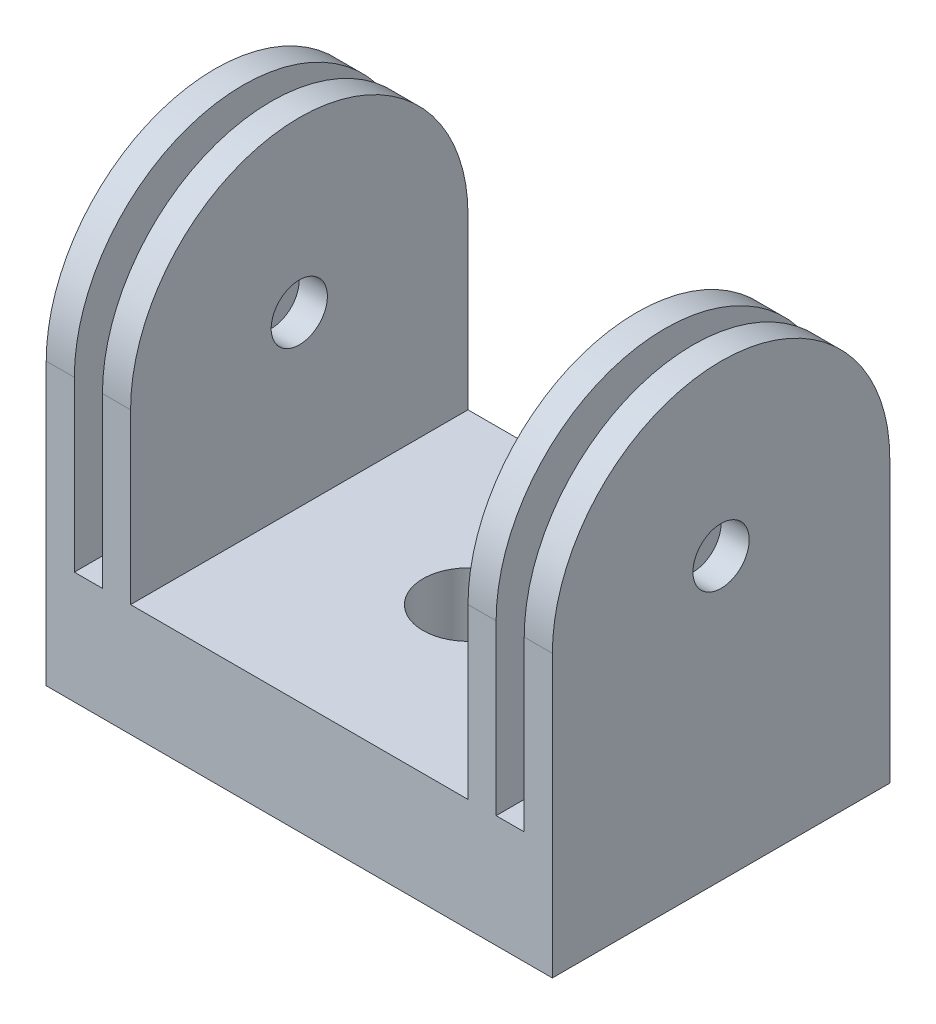
ISO-10303-21;
HEADER;
FILE_DESCRIPTION(('STEP AP214'),'2;1');
FILE_NAME('part.step','',(''),(''),'','','');
FILE_SCHEMA(('AUTOMOTIVE_DESIGN { 1 0 10303 214 1 1 1 1 }'));
ENDSEC;
DATA;
#1=APPLICATION_CONTEXT('core data for automotive mechanical design processes');
#2=APPLICATION_PROTOCOL_DEFINITION('international standard','automotive_design',2000,#1);
#3=PRODUCT_CONTEXT('',#1,'mechanical');
#4=PRODUCT('Part','Part','',(#3));
#5=PRODUCT_RELATED_PRODUCT_CATEGORY('part','',(#4));
#6=PRODUCT_DEFINITION_FORMATION('','',#4);
#7=PRODUCT_DEFINITION_CONTEXT('part definition',#1,'design');
#8=PRODUCT_DEFINITION('design','',#6,#7);
#9=PRODUCT_DEFINITION_SHAPE('','',#8);
#10=(LENGTH_UNIT() NAMED_UNIT(*) SI_UNIT(.MILLI.,.METRE.));
#11=(NAMED_UNIT(*) PLANE_ANGLE_UNIT() SI_UNIT($,.RADIAN.));
#12=(NAMED_UNIT(*) SI_UNIT($,.STERADIAN.) SOLID_ANGLE_UNIT());
#13=UNCERTAINTY_MEASURE_WITH_UNIT(LENGTH_MEASURE(1.E-05),#10,'distance_accuracy_value','');
#14=(GEOMETRIC_REPRESENTATION_CONTEXT(3) GLOBAL_UNCERTAINTY_ASSIGNED_CONTEXT((#13)) GLOBAL_UNIT_ASSIGNED_CONTEXT((#10,
#11,#12)) REPRESENTATION_CONTEXT('',''));
#15=CARTESIAN_POINT('',(0.,0.,0.));
#16=DIRECTION('',(0.,0.,1.));
#17=DIRECTION('',(1.,0.,0.));
#18=AXIS2_PLACEMENT_3D('',#15,#16,#17);
#19=CARTESIAN_POINT('',(0.,10.,0.));
#20=DIRECTION('',(0.,1.,0.));
#21=DIRECTION('',(0.,0.,1.));
#22=AXIS2_PLACEMENT_3D('',#19,#20,#21);
#23=PLANE('',#22);
#24=CARTESIAN_POINT('',(0.,10.,0.));
#25=DIRECTION('',(0.,1.,0.));
#26=DIRECTION('',(0.,0.,1.));
#27=AXIS2_PLACEMENT_3D('',#24,#25,#26);
#28=CIRCLE('',#27,4.);
#29=CARTESIAN_POINT('',(0.,10.,4.));
#30=VERTEX_POINT('',#29);
#31=EDGE_CURVE('E330',#30,#30,#28,.T.);
#32=ORIENTED_EDGE('',*,*,#31,.F.);
#33=EDGE_LOOP('',(#32));
#34=FACE_BOUND('',#33,.T.);
#35=DIRECTION('',(1.,0.,0.));
#36=VECTOR('',#35,1.);
#37=CARTESIAN_POINT('',(0.,10.,-15.));
#38=LINE('',#37,#36);
#39=CARTESIAN_POINT('',(-15.,10.,-15.));
#40=VERTEX_POINT('',#39);
#41=CARTESIAN_POINT('',(15.,10.,-15.));
#42=VERTEX_POINT('',#41);
#43=EDGE_CURVE('E71',#40,#42,#38,.T.);
#44=ORIENTED_EDGE('',*,*,#43,.F.);
#45=DIRECTION('',(0.,0.,-1.));
#46=VECTOR('',#45,1.);
#47=CARTESIAN_POINT('',(-15.,10.,15.));
#48=LINE('',#47,#46);
#49=CARTESIAN_POINT('',(-15.,10.,15.));
#50=VERTEX_POINT('',#49);
#51=EDGE_CURVE('E234',#50,#40,#48,.T.);
#52=ORIENTED_EDGE('',*,*,#51,.F.);
#53=DIRECTION('',(1.,0.,0.));
#54=VECTOR('',#53,1.);
#55=CARTESIAN_POINT('',(0.,10.,15.));
#56=LINE('',#55,#54);
#57=CARTESIAN_POINT('',(15.,10.,15.));
#58=VERTEX_POINT('',#57);
#59=EDGE_CURVE('E342',#50,#58,#56,.T.);
#60=ORIENTED_EDGE('',*,*,#59,.T.);
#61=DIRECTION('',(0.,0.,-1.));
#62=VECTOR('',#61,1.);
#63=CARTESIAN_POINT('',(15.,10.,15.));
#64=LINE('',#63,#62);
#65=EDGE_CURVE('E264',#58,#42,#64,.T.);
#66=ORIENTED_EDGE('',*,*,#65,.T.);
#67=EDGE_LOOP('',(#44,#52,#60,#66));
#68=FACE_BOUND('',#67,.T.);
#69=ADVANCED_FACE('F47',(#34,#68),#23,.T.);
#70=DIRECTION('',(0.,0.,-1.));
#71=VECTOR('',#70,1.);
#72=CARTESIAN_POINT('',(-20.,10.,15.));
#73=LINE('',#72,#71);
#74=CARTESIAN_POINT('',(-20.,10.,15.));
#75=VERTEX_POINT('',#74);
#76=CARTESIAN_POINT('',(-20.,10.,-15.));
#77=VERTEX_POINT('',#76);
#78=EDGE_CURVE('E185',#75,#77,#73,.T.);
#79=ORIENTED_EDGE('',*,*,#78,.F.);
#80=CARTESIAN_POINT('',(-17.5,10.,15.));
#81=VERTEX_POINT('',#80);
#82=EDGE_CURVE('E190',#75,#81,#56,.T.);
#83=ORIENTED_EDGE('',*,*,#82,.T.);
#84=DIRECTION('',(0.,0.,-1.));
#85=VECTOR('',#84,1.);
#86=CARTESIAN_POINT('',(-17.5,10.,15.));
#87=LINE('',#86,#85);
#88=CARTESIAN_POINT('',(-17.5,10.,-15.));
#89=VERTEX_POINT('',#88);
#90=EDGE_CURVE('E218',#81,#89,#87,.T.);
#91=ORIENTED_EDGE('',*,*,#90,.T.);
#92=EDGE_CURVE('E63',#77,#89,#38,.T.);
#93=ORIENTED_EDGE('',*,*,#92,.F.);
#94=EDGE_LOOP('',(#79,#83,#91,#93));
#95=FACE_BOUND('',#94,.T.);
#96=ADVANCED_FACE('F423',(#95),#23,.T.);
#97=DIRECTION('',(0.,0.,-1.));
#98=VECTOR('',#97,1.);
#99=CARTESIAN_POINT('',(17.5,10.,15.));
#100=LINE('',#99,#98);
#101=CARTESIAN_POINT('',(17.5,10.,15.));
#102=VERTEX_POINT('',#101);
#103=CARTESIAN_POINT('',(17.5,10.,-15.));
#104=VERTEX_POINT('',#103);
#105=EDGE_CURVE('E270',#102,#104,#100,.T.);
#106=ORIENTED_EDGE('',*,*,#105,.F.);
#107=CARTESIAN_POINT('',(20.,10.,15.));
#108=VERTEX_POINT('',#107);
#109=EDGE_CURVE('E338',#102,#108,#56,.T.);
#110=ORIENTED_EDGE('',*,*,#109,.T.);
#111=DIRECTION('',(0.,0.,-1.));
#112=VECTOR('',#111,1.);
#113=CARTESIAN_POINT('',(20.,10.,15.));
#114=LINE('',#113,#112);
#115=CARTESIAN_POINT('',(20.,10.,-15.));
#116=VERTEX_POINT('',#115);
#117=EDGE_CURVE('E306',#108,#116,#114,.T.);
#118=ORIENTED_EDGE('',*,*,#117,.T.);
#119=EDGE_CURVE('E334',#104,#116,#38,.T.);
#120=ORIENTED_EDGE('',*,*,#119,.F.);
#121=EDGE_LOOP('',(#106,#110,#118,#120));
#122=FACE_BOUND('',#121,.T.);
#123=ADVANCED_FACE('F391',(#122),#23,.T.);
#124=CARTESIAN_POINT('',(22.5,10.,0.));
#125=DIRECTION('',(1.,0.,0.));
#126=DIRECTION('',(0.,0.,-1.));
#127=AXIS2_PLACEMENT_3D('',#124,#125,#126);
#128=PLANE('',#127);
#129=DIRECTION('',(0.,0.,1.));
#130=VECTOR('',#129,1.);
#131=CARTESIAN_POINT('',(22.5,0.,0.));
#132=LINE('',#131,#130);
#133=CARTESIAN_POINT('',(22.5,0.,-15.));
#134=VERTEX_POINT('',#133);
#135=CARTESIAN_POINT('',(22.5,0.,15.));
#136=VERTEX_POINT('',#135);
#137=EDGE_CURVE('E346',#134,#136,#132,.T.);
#138=ORIENTED_EDGE('',*,*,#137,.F.);
#139=DIRECTION('',(0.,-1.,0.));
#140=VECTOR('',#139,1.);
#141=CARTESIAN_POINT('',(22.5,10.,-15.));
#142=LINE('',#141,#140);
#143=CARTESIAN_POINT('',(22.5,25.,-15.));
#144=VERTEX_POINT('',#143);
#145=EDGE_CURVE('E11',#144,#134,#142,.T.);
#146=ORIENTED_EDGE('',*,*,#145,.F.);
#147=CARTESIAN_POINT('',(22.5,25.,0.));
#148=DIRECTION('',(1.,0.,0.));
#149=DIRECTION('',(0.,0.,1.));
#150=AXIS2_PLACEMENT_3D('',#147,#148,#149);
#151=CIRCLE('',#150,15.);
#152=CARTESIAN_POINT('',(22.5,25.,15.));
#153=VERTEX_POINT('',#152);
#154=EDGE_CURVE('E298',#144,#153,#151,.T.);
#155=ORIENTED_EDGE('',*,*,#154,.T.);
#156=DIRECTION('',(0.,-1.,0.));
#157=VECTOR('',#156,1.);
#158=CARTESIAN_POINT('',(22.5,10.,15.));
#159=LINE('',#158,#157);
#160=EDGE_CURVE('E341',#153,#136,#159,.T.);
#161=ORIENTED_EDGE('',*,*,#160,.T.);
#162=EDGE_LOOP('',(#138,#146,#155,#161));
#163=FACE_BOUND('',#162,.T.);
#164=CARTESIAN_POINT('',(22.5,25.,0.));
#165=DIRECTION('',(1.,0.,0.));
#166=DIRECTION('',(0.,0.,-1.));
#167=AXIS2_PLACEMENT_3D('',#164,#165,#166);
#168=CIRCLE('',#167,2.5);
#169=CARTESIAN_POINT('',(22.5,25.,-2.5));
#170=VERTEX_POINT('',#169);
#171=EDGE_CURVE('E290',#170,#170,#168,.T.);
#172=ORIENTED_EDGE('',*,*,#171,.F.);
#173=EDGE_LOOP('',(#172));
#174=FACE_BOUND('',#173,.T.);
#175=ADVANCED_FACE('F377',(#163,#174),#128,.T.);
#176=CARTESIAN_POINT('',(0.,10.,-15.));
#177=DIRECTION('',(0.,0.,-1.));
#178=DIRECTION('',(-1.,0.,0.));
#179=AXIS2_PLACEMENT_3D('',#176,#177,#178);
#180=PLANE('',#179);
#181=DIRECTION('',(1.,0.,0.));
#182=VECTOR('',#181,1.);
#183=CARTESIAN_POINT('',(0.,0.,-15.));
#184=LINE('',#183,#182);
#185=CARTESIAN_POINT('',(-22.5,0.,-15.));
#186=VERTEX_POINT('',#185);
#187=EDGE_CURVE('E350',#186,#134,#184,.T.);
#188=ORIENTED_EDGE('',*,*,#187,.F.);
#189=DIRECTION('',(0.,-1.,0.));
#190=VECTOR('',#189,1.);
#191=CARTESIAN_POINT('',(-22.5,10.,-15.));
#192=LINE('',#191,#190);
#193=CARTESIAN_POINT('',(-22.5,25.,-15.));
#194=VERTEX_POINT('',#193);
#195=EDGE_CURVE('E56',#194,#186,#192,.T.);
#196=ORIENTED_EDGE('',*,*,#195,.F.);
#197=DIRECTION('',(-1.,0.,0.));
#198=VECTOR('',#197,1.);
#199=CARTESIAN_POINT('',(-20.,25.,-15.));
#200=LINE('',#199,#198);
#201=CARTESIAN_POINT('',(-20.,25.,-15.));
#202=VERTEX_POINT('',#201);
#203=EDGE_CURVE('E184',#202,#194,#200,.T.);
#204=ORIENTED_EDGE('',*,*,#203,.F.);
#205=DIRECTION('',(0.,1.,0.));
#206=VECTOR('',#205,1.);
#207=CARTESIAN_POINT('',(-20.,10.,-15.));
#208=LINE('',#207,#206);
#209=EDGE_CURVE('E169',#77,#202,#208,.T.);
#210=ORIENTED_EDGE('',*,*,#209,.F.);
#211=ORIENTED_EDGE('',*,*,#92,.T.);
#212=DIRECTION('',(0.,1.,0.));
#213=VECTOR('',#212,1.);
#214=CARTESIAN_POINT('',(-17.5,10.,-15.));
#215=LINE('',#214,#213);
#216=CARTESIAN_POINT('',(-17.5,25.,-15.));
#217=VERTEX_POINT('',#216);
#218=EDGE_CURVE('E222',#89,#217,#215,.T.);
#219=ORIENTED_EDGE('',*,*,#218,.T.);
#220=DIRECTION('',(1.,0.,0.));
#221=VECTOR('',#220,1.);
#222=CARTESIAN_POINT('',(-17.5,25.,-15.));
#223=LINE('',#222,#221);
#224=CARTESIAN_POINT('',(-15.,25.,-15.));
#225=VERTEX_POINT('',#224);
#226=EDGE_CURVE('E230',#217,#225,#223,.T.);
#227=ORIENTED_EDGE('',*,*,#226,.T.);
#228=DIRECTION('',(0.,1.,0.));
#229=VECTOR('',#228,1.);
#230=CARTESIAN_POINT('',(-15.,10.,-15.));
#231=LINE('',#230,#229);
#232=EDGE_CURVE('E238',#40,#225,#231,.T.);
#233=ORIENTED_EDGE('',*,*,#232,.F.);
#234=ORIENTED_EDGE('',*,*,#43,.T.);
#235=DIRECTION('',(0.,1.,0.));
#236=VECTOR('',#235,1.);
#237=CARTESIAN_POINT('',(15.,10.,-15.));
#238=LINE('',#237,#236);
#239=CARTESIAN_POINT('',(15.,25.,-15.));
#240=VERTEX_POINT('',#239);
#241=EDGE_CURVE('E281',#42,#240,#238,.T.);
#242=ORIENTED_EDGE('',*,*,#241,.T.);
#243=DIRECTION('',(-1.,0.,0.));
#244=VECTOR('',#243,1.);
#245=CARTESIAN_POINT('',(17.5,25.,-15.));
#246=LINE('',#245,#244);
#247=CARTESIAN_POINT('',(17.5,25.,-15.));
#248=VERTEX_POINT('',#247);
#249=EDGE_CURVE('E286',#248,#240,#246,.T.);
#250=ORIENTED_EDGE('',*,*,#249,.F.);
#251=DIRECTION('',(0.,1.,0.));
#252=VECTOR('',#251,1.);
#253=CARTESIAN_POINT('',(17.5,10.,-15.));
#254=LINE('',#253,#252);
#255=EDGE_CURVE('E267',#104,#248,#254,.T.);
#256=ORIENTED_EDGE('',*,*,#255,.F.);
#257=ORIENTED_EDGE('',*,*,#119,.T.);
#258=DIRECTION('',(0.,1.,0.));
#259=VECTOR('',#258,1.);
#260=CARTESIAN_POINT('',(20.,10.,-15.));
#261=LINE('',#260,#259);
#262=CARTESIAN_POINT('',(20.,25.,-15.));
#263=VERTEX_POINT('',#262);
#264=EDGE_CURVE('E310',#116,#263,#261,.T.);
#265=ORIENTED_EDGE('',*,*,#264,.T.);
#266=DIRECTION('',(1.,0.,0.));
#267=VECTOR('',#266,1.);
#268=CARTESIAN_POINT('',(20.,25.,-15.));
#269=LINE('',#268,#267);
#270=EDGE_CURVE('E318',#263,#144,#269,.T.);
#271=ORIENTED_EDGE('',*,*,#270,.T.);
#272=ORIENTED_EDGE('',*,*,#145,.T.);
#273=EDGE_LOOP('',(#188,#196,#204,#210,#211,#219,#227,#233,#234,#242,#250,#256,#257,#265,#271,#272));
#274=FACE_BOUND('',#273,.T.);
#275=ADVANCED_FACE('F373',(#274),#180,.T.);
#276=CARTESIAN_POINT('',(-22.5,10.,0.));
#277=DIRECTION('',(1.,0.,0.));
#278=DIRECTION('',(0.,0.,-1.));
#279=AXIS2_PLACEMENT_3D('',#276,#277,#278);
#280=PLANE('',#279);
#281=DIRECTION('',(0.,0.,1.));
#282=VECTOR('',#281,1.);
#283=CARTESIAN_POINT('',(-22.5,0.,0.));
#284=LINE('',#283,#282);
#285=CARTESIAN_POINT('',(-22.5,0.,15.));
#286=VERTEX_POINT('',#285);
#287=EDGE_CURVE('E354',#186,#286,#284,.T.);
#288=ORIENTED_EDGE('',*,*,#287,.T.);
#289=DIRECTION('',(0.,-1.,0.));
#290=VECTOR('',#289,1.);
#291=CARTESIAN_POINT('',(-22.5,10.,15.));
#292=LINE('',#291,#290);
#293=CARTESIAN_POINT('',(-22.5,25.,15.));
#294=VERTEX_POINT('',#293);
#295=EDGE_CURVE('E362',#294,#286,#292,.T.);
#296=ORIENTED_EDGE('',*,*,#295,.F.);
#297=CARTESIAN_POINT('',(-22.5,25.,0.));
#298=DIRECTION('',(1.,0.,0.));
#299=DIRECTION('',(0.,0.,1.));
#300=AXIS2_PLACEMENT_3D('',#297,#298,#299);
#301=CIRCLE('',#300,15.);
#302=EDGE_CURVE('E180',#194,#294,#301,.T.);
#303=ORIENTED_EDGE('',*,*,#302,.F.);
#304=ORIENTED_EDGE('',*,*,#195,.T.);
#305=EDGE_LOOP('',(#288,#296,#303,#304));
#306=FACE_BOUND('',#305,.T.);
#307=CARTESIAN_POINT('',(-22.5,25.,0.));
#308=DIRECTION('',(1.,0.,0.));
#309=DIRECTION('',(0.,0.,-1.));
#310=AXIS2_PLACEMENT_3D('',#307,#308,#309);
#311=CIRCLE('',#310,2.5);
#312=CARTESIAN_POINT('',(-22.5,25.,-2.5));
#313=VERTEX_POINT('',#312);
#314=EDGE_CURVE('E197',#313,#313,#311,.T.);
#315=ORIENTED_EDGE('',*,*,#314,.T.);
#316=EDGE_LOOP('',(#315));
#317=FACE_BOUND('',#316,.T.);
#318=ADVANCED_FACE('F367',(#306,#317),#280,.F.);
#319=CARTESIAN_POINT('',(0.,10.,0.));
#320=DIRECTION('',(0.,-1.,0.));
#321=DIRECTION('',(0.,0.,-1.));
#322=AXIS2_PLACEMENT_3D('',#319,#320,#321);
#323=CYLINDRICAL_SURFACE('',#322,4.);
#324=ORIENTED_EDGE('',*,*,#31,.T.);
#325=EDGE_LOOP('',(#324));
#326=FACE_BOUND('',#325,.T.);
#327=CARTESIAN_POINT('',(0.,0.,0.));
#328=DIRECTION('',(0.,1.,0.));
#329=DIRECTION('',(0.,0.,1.));
#330=AXIS2_PLACEMENT_3D('',#327,#328,#329);
#331=CIRCLE('',#330,4.);
#332=CARTESIAN_POINT('',(0.,0.,4.));
#333=VERTEX_POINT('',#332);
#334=EDGE_CURVE('E326',#333,#333,#331,.T.);
#335=ORIENTED_EDGE('',*,*,#334,.F.);
#336=EDGE_LOOP('',(#335));
#337=FACE_BOUND('',#336,.T.);
#338=ADVANCED_FACE('F49',(#326,#337),#323,.F.);
#339=CARTESIAN_POINT('',(0.,10.,15.));
#340=DIRECTION('',(0.,0.,-1.));
#341=DIRECTION('',(-1.,0.,0.));
#342=AXIS2_PLACEMENT_3D('',#339,#340,#341);
#343=PLANE('',#342);
#344=DIRECTION('',(1.,0.,0.));
#345=VECTOR('',#344,1.);
#346=CARTESIAN_POINT('',(0.,0.,15.));
#347=LINE('',#346,#345);
#348=EDGE_CURVE('E335',#286,#136,#347,.T.);
#349=ORIENTED_EDGE('',*,*,#348,.T.);
#350=ORIENTED_EDGE('',*,*,#160,.F.);
#351=DIRECTION('',(1.,0.,0.));
#352=VECTOR('',#351,1.);
#353=CARTESIAN_POINT('',(20.,25.,15.));
#354=LINE('',#353,#352);
#355=CARTESIAN_POINT('',(20.,25.,15.));
#356=VERTEX_POINT('',#355);
#357=EDGE_CURVE('E322',#356,#153,#354,.T.);
#358=ORIENTED_EDGE('',*,*,#357,.F.);
#359=DIRECTION('',(0.,-1.,0.));
#360=VECTOR('',#359,1.);
#361=CARTESIAN_POINT('',(20.,10.,15.));
#362=LINE('',#361,#360);
#363=EDGE_CURVE('E302',#356,#108,#362,.T.);
#364=ORIENTED_EDGE('',*,*,#363,.T.);
#365=ORIENTED_EDGE('',*,*,#109,.F.);
#366=DIRECTION('',(0.,-1.,0.));
#367=VECTOR('',#366,1.);
#368=CARTESIAN_POINT('',(17.5,10.,15.));
#369=LINE('',#368,#367);
#370=CARTESIAN_POINT('',(17.5,25.,15.));
#371=VERTEX_POINT('',#370);
#372=EDGE_CURVE('E259',#371,#102,#369,.T.);
#373=ORIENTED_EDGE('',*,*,#372,.F.);
#374=DIRECTION('',(-1.,0.,0.));
#375=VECTOR('',#374,1.);
#376=CARTESIAN_POINT('',(17.5,25.,15.));
#377=LINE('',#376,#375);
#378=CARTESIAN_POINT('',(15.,25.,15.));
#379=VERTEX_POINT('',#378);
#380=EDGE_CURVE('E274',#371,#379,#377,.T.);
#381=ORIENTED_EDGE('',*,*,#380,.T.);
#382=DIRECTION('',(0.,-1.,0.));
#383=VECTOR('',#382,1.);
#384=CARTESIAN_POINT('',(15.,10.,15.));
#385=LINE('',#384,#383);
#386=EDGE_CURVE('E255',#379,#58,#385,.T.);
#387=ORIENTED_EDGE('',*,*,#386,.T.);
#388=ORIENTED_EDGE('',*,*,#59,.F.);
#389=DIRECTION('',(0.,-1.,0.));
#390=VECTOR('',#389,1.);
#391=CARTESIAN_POINT('',(-15.,10.,15.));
#392=LINE('',#391,#390);
#393=CARTESIAN_POINT('',(-15.,25.,15.));
#394=VERTEX_POINT('',#393);
#395=EDGE_CURVE('E211',#394,#50,#392,.T.);
#396=ORIENTED_EDGE('',*,*,#395,.F.);
#397=DIRECTION('',(1.,0.,0.));
#398=VECTOR('',#397,1.);
#399=CARTESIAN_POINT('',(-17.5,25.,15.));
#400=LINE('',#399,#398);
#401=CARTESIAN_POINT('',(-17.5,25.,15.));
#402=VERTEX_POINT('',#401);
#403=EDGE_CURVE('E245',#402,#394,#400,.T.);
#404=ORIENTED_EDGE('',*,*,#403,.F.);
#405=DIRECTION('',(0.,-1.,0.));
#406=VECTOR('',#405,1.);
#407=CARTESIAN_POINT('',(-17.5,10.,15.));
#408=LINE('',#407,#406);
#409=EDGE_CURVE('E215',#402,#81,#408,.T.);
#410=ORIENTED_EDGE('',*,*,#409,.T.);
#411=ORIENTED_EDGE('',*,*,#82,.F.);
#412=DIRECTION('',(0.,-1.,0.));
#413=VECTOR('',#412,1.);
#414=CARTESIAN_POINT('',(-20.,10.,15.));
#415=LINE('',#414,#413);
#416=CARTESIAN_POINT('',(-20.,25.,15.));
#417=VERTEX_POINT('',#416);
#418=EDGE_CURVE('E167',#417,#75,#415,.T.);
#419=ORIENTED_EDGE('',*,*,#418,.F.);
#420=DIRECTION('',(-1.,0.,0.));
#421=VECTOR('',#420,1.);
#422=CARTESIAN_POINT('',(-20.,25.,15.));
#423=LINE('',#422,#421);
#424=EDGE_CURVE('E177',#417,#294,#423,.T.);
#425=ORIENTED_EDGE('',*,*,#424,.T.);
#426=ORIENTED_EDGE('',*,*,#295,.T.);
#427=EDGE_LOOP('',(#349,#350,#358,#364,#365,#373,#381,#387,#388,#396,#404,#410,#411,#419,#425,#426));
#428=FACE_BOUND('',#427,.T.);
#429=ADVANCED_FACE('F188',(#428),#343,.F.);
#430=CARTESIAN_POINT('',(0.,0.,0.));
#431=DIRECTION('',(0.,1.,0.));
#432=DIRECTION('',(0.,0.,1.));
#433=AXIS2_PLACEMENT_3D('',#430,#431,#432);
#434=PLANE('',#433);
#435=ORIENTED_EDGE('',*,*,#334,.T.);
#436=EDGE_LOOP('',(#435));
#437=FACE_BOUND('',#436,.T.);
#438=ORIENTED_EDGE('',*,*,#137,.T.);
#439=ORIENTED_EDGE('',*,*,#348,.F.);
#440=ORIENTED_EDGE('',*,*,#287,.F.);
#441=ORIENTED_EDGE('',*,*,#187,.T.);
#442=EDGE_LOOP('',(#438,#439,#440,#441));
#443=FACE_BOUND('',#442,.T.);
#444=ADVANCED_FACE('F372',(#437,#443),#434,.F.);
#445=CARTESIAN_POINT('',(20.,25.,0.));
#446=DIRECTION('',(1.,0.,0.));
#447=DIRECTION('',(0.,0.,-1.));
#448=AXIS2_PLACEMENT_3D('',#445,#446,#447);
#449=CYLINDRICAL_SURFACE('',#448,15.);
#450=ORIENTED_EDGE('',*,*,#154,.F.);
#451=ORIENTED_EDGE('',*,*,#270,.F.);
#452=CARTESIAN_POINT('',(20.,25.,0.));
#453=DIRECTION('',(1.,0.,0.));
#454=DIRECTION('',(0.,0.,1.));
#455=AXIS2_PLACEMENT_3D('',#452,#453,#454);
#456=CIRCLE('',#455,15.);
#457=EDGE_CURVE('E314',#263,#356,#456,.T.);
#458=ORIENTED_EDGE('',*,*,#457,.T.);
#459=ORIENTED_EDGE('',*,*,#357,.T.);
#460=EDGE_LOOP('',(#450,#451,#458,#459));
#461=FACE_BOUND('',#460,.T.);
#462=ADVANCED_FACE('F381',(#461),#449,.T.);
#463=CARTESIAN_POINT('',(20.,25.,0.));
#464=DIRECTION('',(-1.,0.,0.));
#465=DIRECTION('',(0.,0.,1.));
#466=AXIS2_PLACEMENT_3D('',#463,#464,#465);
#467=PLANE('',#466);
#468=CARTESIAN_POINT('',(20.,25.,0.));
#469=DIRECTION('',(1.,0.,0.));
#470=DIRECTION('',(0.,0.,-1.));
#471=AXIS2_PLACEMENT_3D('',#468,#469,#470);
#472=CIRCLE('',#471,2.5);
#473=CARTESIAN_POINT('',(20.,25.,-2.5));
#474=VERTEX_POINT('',#473);
#475=EDGE_CURVE('E294',#474,#474,#472,.T.);
#476=ORIENTED_EDGE('',*,*,#475,.T.);
#477=EDGE_LOOP('',(#476));
#478=FACE_BOUND('',#477,.T.);
#479=ORIENTED_EDGE('',*,*,#363,.F.);
#480=ORIENTED_EDGE('',*,*,#457,.F.);
#481=ORIENTED_EDGE('',*,*,#264,.F.);
#482=ORIENTED_EDGE('',*,*,#117,.F.);
#483=EDGE_LOOP('',(#479,#480,#481,#482));
#484=FACE_BOUND('',#483,.T.);
#485=ADVANCED_FACE('F385',(#478,#484),#467,.T.);
#486=CARTESIAN_POINT('',(20.,25.,0.));
#487=DIRECTION('',(1.,0.,0.));
#488=DIRECTION('',(0.,0.,-1.));
#489=AXIS2_PLACEMENT_3D('',#486,#487,#488);
#490=CYLINDRICAL_SURFACE('',#489,2.5);
#491=ORIENTED_EDGE('',*,*,#475,.F.);
#492=EDGE_LOOP('',(#491));
#493=FACE_BOUND('',#492,.T.);
#494=ORIENTED_EDGE('',*,*,#171,.T.);
#495=EDGE_LOOP('',(#494));
#496=FACE_BOUND('',#495,.T.);
#497=ADVANCED_FACE('F464',(#493,#496),#490,.F.);
#498=CARTESIAN_POINT('',(17.5,25.,0.));
#499=DIRECTION('',(1.,0.,0.));
#500=DIRECTION('',(0.,0.,1.));
#501=AXIS2_PLACEMENT_3D('',#498,#499,#500);
#502=PLANE('',#501);
#503=ORIENTED_EDGE('',*,*,#372,.T.);
#504=ORIENTED_EDGE('',*,*,#105,.T.);
#505=ORIENTED_EDGE('',*,*,#255,.T.);
#506=CARTESIAN_POINT('',(17.5,25.,0.));
#507=DIRECTION('',(1.,0.,0.));
#508=DIRECTION('',(0.,0.,1.));
#509=AXIS2_PLACEMENT_3D('',#506,#507,#508);
#510=CIRCLE('',#509,15.);
#511=EDGE_CURVE('E263',#248,#371,#510,.T.);
#512=ORIENTED_EDGE('',*,*,#511,.T.);
#513=EDGE_LOOP('',(#503,#504,#505,#512));
#514=FACE_BOUND('',#513,.T.);
#515=CARTESIAN_POINT('',(17.5,25.,0.));
#516=DIRECTION('',(1.,0.,0.));
#517=DIRECTION('',(0.,0.,-1.));
#518=AXIS2_PLACEMENT_3D('',#515,#516,#517);
#519=CIRCLE('',#518,2.5);
#520=CARTESIAN_POINT('',(17.5,25.,-2.5));
#521=VERTEX_POINT('',#520);
#522=EDGE_CURVE('E251',#521,#521,#519,.T.);
#523=ORIENTED_EDGE('',*,*,#522,.F.);
#524=EDGE_LOOP('',(#523));
#525=FACE_BOUND('',#524,.T.);
#526=ADVANCED_FACE('F394',(#514,#525),#502,.T.);
#527=CARTESIAN_POINT('',(15.,25.,0.));
#528=DIRECTION('',(1.,0.,0.));
#529=DIRECTION('',(0.,0.,1.));
#530=AXIS2_PLACEMENT_3D('',#527,#528,#529);
#531=PLANE('',#530);
#532=ORIENTED_EDGE('',*,*,#386,.F.);
#533=CARTESIAN_POINT('',(15.,25.,0.));
#534=DIRECTION('',(1.,0.,0.));
#535=DIRECTION('',(0.,0.,1.));
#536=AXIS2_PLACEMENT_3D('',#533,#534,#535);
#537=CIRCLE('',#536,15.);
#538=EDGE_CURVE('E278',#240,#379,#537,.T.);
#539=ORIENTED_EDGE('',*,*,#538,.F.);
#540=ORIENTED_EDGE('',*,*,#241,.F.);
#541=ORIENTED_EDGE('',*,*,#65,.F.);
#542=EDGE_LOOP('',(#532,#539,#540,#541));
#543=FACE_BOUND('',#542,.T.);
#544=CARTESIAN_POINT('',(15.,25.,0.));
#545=DIRECTION('',(1.,0.,0.));
#546=DIRECTION('',(0.,0.,-1.));
#547=AXIS2_PLACEMENT_3D('',#544,#545,#546);
#548=CIRCLE('',#547,2.5);
#549=CARTESIAN_POINT('',(15.,25.,-2.5));
#550=VERTEX_POINT('',#549);
#551=EDGE_CURVE('E248',#550,#550,#548,.T.);
#552=ORIENTED_EDGE('',*,*,#551,.T.);
#553=EDGE_LOOP('',(#552));
#554=FACE_BOUND('',#553,.T.);
#555=ADVANCED_FACE('F405',(#543,#554),#531,.F.);
#556=CARTESIAN_POINT('',(17.5,25.,0.));
#557=DIRECTION('',(-1.,0.,0.));
#558=DIRECTION('',(0.,0.,1.));
#559=AXIS2_PLACEMENT_3D('',#556,#557,#558);
#560=CYLINDRICAL_SURFACE('',#559,15.);
#561=ORIENTED_EDGE('',*,*,#538,.T.);
#562=ORIENTED_EDGE('',*,*,#380,.F.);
#563=ORIENTED_EDGE('',*,*,#511,.F.);
#564=ORIENTED_EDGE('',*,*,#249,.T.);
#565=EDGE_LOOP('',(#561,#562,#563,#564));
#566=FACE_BOUND('',#565,.T.);
#567=ADVANCED_FACE('F400',(#566),#560,.T.);
#568=CARTESIAN_POINT('',(17.5,25.,0.));
#569=DIRECTION('',(-1.,0.,0.));
#570=DIRECTION('',(0.,0.,1.));
#571=AXIS2_PLACEMENT_3D('',#568,#569,#570);
#572=CYLINDRICAL_SURFACE('',#571,2.5);
#573=ORIENTED_EDGE('',*,*,#522,.T.);
#574=EDGE_LOOP('',(#573));
#575=FACE_BOUND('',#574,.T.);
#576=ORIENTED_EDGE('',*,*,#551,.F.);
#577=EDGE_LOOP('',(#576));
#578=FACE_BOUND('',#577,.T.);
#579=ADVANCED_FACE('F499',(#575,#578),#572,.F.);
#580=CARTESIAN_POINT('',(-17.5,25.,0.));
#581=DIRECTION('',(1.,0.,0.));
#582=DIRECTION('',(0.,0.,-1.));
#583=AXIS2_PLACEMENT_3D('',#580,#581,#582);
#584=CYLINDRICAL_SURFACE('',#583,15.);
#585=CARTESIAN_POINT('',(-15.,25.,0.));
#586=DIRECTION('',(1.,0.,0.));
#587=DIRECTION('',(0.,0.,1.));
#588=AXIS2_PLACEMENT_3D('',#585,#586,#587);
#589=CIRCLE('',#588,15.);
#590=EDGE_CURVE('E219',#225,#394,#589,.T.);
#591=ORIENTED_EDGE('',*,*,#590,.F.);
#592=ORIENTED_EDGE('',*,*,#226,.F.);
#593=CARTESIAN_POINT('',(-17.5,25.,0.));
#594=DIRECTION('',(1.,0.,0.));
#595=DIRECTION('',(0.,0.,1.));
#596=AXIS2_PLACEMENT_3D('',#593,#594,#595);
#597=CIRCLE('',#596,15.);
#598=EDGE_CURVE('E226',#217,#402,#597,.T.);
#599=ORIENTED_EDGE('',*,*,#598,.T.);
#600=ORIENTED_EDGE('',*,*,#403,.T.);
#601=EDGE_LOOP('',(#591,#592,#599,#600));
#602=FACE_BOUND('',#601,.T.);
#603=ADVANCED_FACE('F422',(#602),#584,.T.);
#604=CARTESIAN_POINT('',(-17.5,25.,0.));
#605=DIRECTION('',(-1.,0.,0.));
#606=DIRECTION('',(0.,0.,1.));
#607=AXIS2_PLACEMENT_3D('',#604,#605,#606);
#608=PLANE('',#607);
#609=CARTESIAN_POINT('',(-17.5,25.,0.));
#610=DIRECTION('',(1.,0.,0.));
#611=DIRECTION('',(0.,0.,-1.));
#612=AXIS2_PLACEMENT_3D('',#609,#610,#611);
#613=CIRCLE('',#612,2.5);
#614=CARTESIAN_POINT('',(-17.5,25.,-2.5));
#615=VERTEX_POINT('',#614);
#616=EDGE_CURVE('E207',#615,#615,#613,.T.);
#617=ORIENTED_EDGE('',*,*,#616,.T.);
#618=EDGE_LOOP('',(#617));
#619=FACE_BOUND('',#618,.T.);
#620=ORIENTED_EDGE('',*,*,#409,.F.);
#621=ORIENTED_EDGE('',*,*,#598,.F.);
#622=ORIENTED_EDGE('',*,*,#218,.F.);
#623=ORIENTED_EDGE('',*,*,#90,.F.);
#624=EDGE_LOOP('',(#620,#621,#622,#623));
#625=FACE_BOUND('',#624,.T.);
#626=ADVANCED_FACE('F420',(#619,#625),#608,.T.);
#627=CARTESIAN_POINT('',(-15.,25.,0.));
#628=DIRECTION('',(-1.,0.,0.));
#629=DIRECTION('',(0.,0.,1.));
#630=AXIS2_PLACEMENT_3D('',#627,#628,#629);
#631=PLANE('',#630);
#632=CARTESIAN_POINT('',(-15.,25.,0.));
#633=DIRECTION('',(1.,0.,0.));
#634=DIRECTION('',(0.,0.,-1.));
#635=AXIS2_PLACEMENT_3D('',#632,#633,#634);
#636=CIRCLE('',#635,2.5);
#637=CARTESIAN_POINT('',(-15.,25.,-2.5));
#638=VERTEX_POINT('',#637);
#639=EDGE_CURVE('E205',#638,#638,#636,.T.);
#640=ORIENTED_EDGE('',*,*,#639,.F.);
#641=EDGE_LOOP('',(#640));
#642=FACE_BOUND('',#641,.T.);
#643=ORIENTED_EDGE('',*,*,#395,.T.);
#644=ORIENTED_EDGE('',*,*,#51,.T.);
#645=ORIENTED_EDGE('',*,*,#232,.T.);
#646=ORIENTED_EDGE('',*,*,#590,.T.);
#647=EDGE_LOOP('',(#643,#644,#645,#646));
#648=FACE_BOUND('',#647,.T.);
#649=ADVANCED_FACE('F414',(#642,#648),#631,.F.);
#650=CARTESIAN_POINT('',(-17.5,25.,0.));
#651=DIRECTION('',(1.,0.,0.));
#652=DIRECTION('',(0.,0.,-1.));
#653=AXIS2_PLACEMENT_3D('',#650,#651,#652);
#654=CYLINDRICAL_SURFACE('',#653,2.5);
#655=ORIENTED_EDGE('',*,*,#616,.F.);
#656=EDGE_LOOP('',(#655));
#657=FACE_BOUND('',#656,.T.);
#658=ORIENTED_EDGE('',*,*,#639,.T.);
#659=EDGE_LOOP('',(#658));
#660=FACE_BOUND('',#659,.T.);
#661=ADVANCED_FACE('F540',(#657,#660),#654,.F.);
#662=CARTESIAN_POINT('',(-20.,25.,0.));
#663=DIRECTION('',(1.,0.,0.));
#664=DIRECTION('',(0.,0.,1.));
#665=AXIS2_PLACEMENT_3D('',#662,#663,#664);
#666=PLANE('',#665);
#667=ORIENTED_EDGE('',*,*,#418,.T.);
#668=ORIENTED_EDGE('',*,*,#78,.T.);
#669=ORIENTED_EDGE('',*,*,#209,.T.);
#670=CARTESIAN_POINT('',(-20.,25.,0.));
#671=DIRECTION('',(1.,0.,0.));
#672=DIRECTION('',(0.,0.,1.));
#673=AXIS2_PLACEMENT_3D('',#670,#671,#672);
#674=CIRCLE('',#673,15.);
#675=EDGE_CURVE('E162',#202,#417,#674,.T.);
#676=ORIENTED_EDGE('',*,*,#675,.T.);
#677=EDGE_LOOP('',(#667,#668,#669,#676));
#678=FACE_BOUND('',#677,.T.);
#679=CARTESIAN_POINT('',(-20.,25.,0.));
#680=DIRECTION('',(1.,0.,0.));
#681=DIRECTION('',(0.,0.,-1.));
#682=AXIS2_PLACEMENT_3D('',#679,#680,#681);
#683=CIRCLE('',#682,2.5);
#684=CARTESIAN_POINT('',(-20.,25.,-2.5));
#685=VERTEX_POINT('',#684);
#686=EDGE_CURVE('E194',#685,#685,#683,.T.);
#687=ORIENTED_EDGE('',*,*,#686,.F.);
#688=EDGE_LOOP('',(#687));
#689=FACE_BOUND('',#688,.T.);
#690=ADVANCED_FACE('F164',(#678,#689),#666,.T.);
#691=CARTESIAN_POINT('',(-20.,25.,0.));
#692=DIRECTION('',(-1.,0.,0.));
#693=DIRECTION('',(0.,0.,1.));
#694=AXIS2_PLACEMENT_3D('',#691,#692,#693);
#695=CYLINDRICAL_SURFACE('',#694,15.);
#696=ORIENTED_EDGE('',*,*,#302,.T.);
#697=ORIENTED_EDGE('',*,*,#424,.F.);
#698=ORIENTED_EDGE('',*,*,#675,.F.);
#699=ORIENTED_EDGE('',*,*,#203,.T.);
#700=EDGE_LOOP('',(#696,#697,#698,#699));
#701=FACE_BOUND('',#700,.T.);
#702=ADVANCED_FACE('F178',(#701),#695,.T.);
#703=CARTESIAN_POINT('',(-20.,25.,0.));
#704=DIRECTION('',(-1.,0.,0.));
#705=DIRECTION('',(0.,0.,1.));
#706=AXIS2_PLACEMENT_3D('',#703,#704,#705);
#707=CYLINDRICAL_SURFACE('',#706,2.5);
#708=ORIENTED_EDGE('',*,*,#686,.T.);
#709=EDGE_LOOP('',(#708));
#710=FACE_BOUND('',#709,.T.);
#711=ORIENTED_EDGE('',*,*,#314,.F.);
#712=EDGE_LOOP('',(#711));
#713=FACE_BOUND('',#712,.T.);
#714=ADVANCED_FACE('F564',(#710,#713),#707,.F.);
#715=CLOSED_SHELL('',(#69,#96,#123,#175,#275,#318,#338,#429,#444,#462,#485,#497,#526,#555,#567,
#579,#603,#626,#649,#661,#690,#702,#714));
#716=MANIFOLD_SOLID_BREP('B2',#715);
#717=ADVANCED_BREP_SHAPE_REPRESENTATION('',(#18,#716),#14);
#718=SHAPE_DEFINITION_REPRESENTATION(#9,#717);
ENDSEC;
END-ISO-10303-21;
